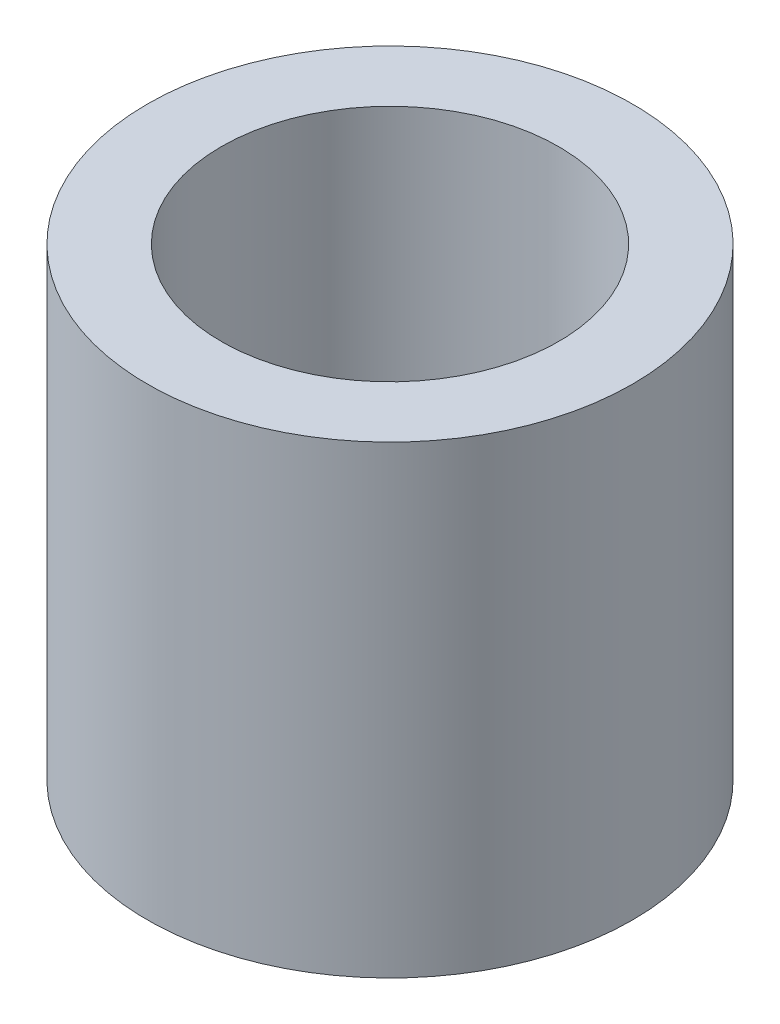
ISO-10303-21;
HEADER;
FILE_DESCRIPTION(('STEP AP214'),'2;1');
FILE_NAME('part.step','',(''),(''),'','','');
FILE_SCHEMA(('AUTOMOTIVE_DESIGN { 1 0 10303 214 1 1 1 1 }'));
ENDSEC;
DATA;
#1=APPLICATION_CONTEXT('core data for automotive mechanical design processes');
#2=APPLICATION_PROTOCOL_DEFINITION('international standard','automotive_design',2000,#1);
#3=PRODUCT_CONTEXT('',#1,'mechanical');
#4=PRODUCT('Part','Part','',(#3));
#5=PRODUCT_RELATED_PRODUCT_CATEGORY('part','',(#4));
#6=PRODUCT_DEFINITION_FORMATION('','',#4);
#7=PRODUCT_DEFINITION_CONTEXT('part definition',#1,'design');
#8=PRODUCT_DEFINITION('design','',#6,#7);
#9=PRODUCT_DEFINITION_SHAPE('','',#8);
#10=(LENGTH_UNIT() NAMED_UNIT(*) SI_UNIT(.MILLI.,.METRE.));
#11=(NAMED_UNIT(*) PLANE_ANGLE_UNIT() SI_UNIT($,.RADIAN.));
#12=(NAMED_UNIT(*) SI_UNIT($,.STERADIAN.) SOLID_ANGLE_UNIT());
#13=UNCERTAINTY_MEASURE_WITH_UNIT(LENGTH_MEASURE(1.E-05),#10,'distance_accuracy_value','');
#14=(GEOMETRIC_REPRESENTATION_CONTEXT(3) GLOBAL_UNCERTAINTY_ASSIGNED_CONTEXT((#13)) GLOBAL_UNIT_ASSIGNED_CONTEXT((#10,
#11,#12)) REPRESENTATION_CONTEXT('',''));
#15=CARTESIAN_POINT('',(0.,0.,0.));
#16=DIRECTION('',(0.,0.,1.));
#17=DIRECTION('',(1.,0.,0.));
#18=AXIS2_PLACEMENT_3D('',#15,#16,#17);
#19=CARTESIAN_POINT('',(0.,0.,0.));
#20=DIRECTION('',(0.,1.,0.));
#21=DIRECTION('',(1.,0.,0.));
#22=AXIS2_PLACEMENT_3D('',#19,#20,#21);
#23=PLANE('',#22);
#24=CARTESIAN_POINT('',(0.,0.,0.));
#25=DIRECTION('',(0.,1.,0.));
#26=DIRECTION('',(-1.,0.,0.));
#27=AXIS2_PLACEMENT_3D('',#24,#25,#26);
#28=CIRCLE('',#27,5.75);
#29=CARTESIAN_POINT('',(-5.75,0.,0.));
#30=VERTEX_POINT('',#29);
#31=EDGE_CURVE('E10',#30,#30,#28,.T.);
#32=ORIENTED_EDGE('',*,*,#31,.F.);
#33=EDGE_LOOP('',(#32));
#34=FACE_BOUND('',#33,.T.);
#35=CARTESIAN_POINT('',(0.,0.,0.));
#36=DIRECTION('',(0.,-1.,0.));
#37=DIRECTION('',(-1.,0.,0.));
#38=AXIS2_PLACEMENT_3D('',#35,#36,#37);
#39=CIRCLE('',#38,4.);
#40=CARTESIAN_POINT('',(-4.,0.,0.));
#41=VERTEX_POINT('',#40);
#42=EDGE_CURVE('E29',#41,#41,#39,.T.);
#43=ORIENTED_EDGE('',*,*,#42,.F.);
#44=EDGE_LOOP('',(#43));
#45=FACE_BOUND('',#44,.T.);
#46=ADVANCED_FACE('F15',(#34,#45),#23,.F.);
#47=CARTESIAN_POINT('',(0.,0.,0.));
#48=DIRECTION('',(0.,1.,0.));
#49=DIRECTION('',(1.,0.,0.));
#50=AXIS2_PLACEMENT_3D('',#47,#48,#49);
#51=CYLINDRICAL_SURFACE('',#50,5.75);
#52=CARTESIAN_POINT('',(0.,11.,0.));
#53=DIRECTION('',(0.,1.,0.));
#54=DIRECTION('',(1.,0.,0.));
#55=AXIS2_PLACEMENT_3D('',#52,#53,#54);
#56=CIRCLE('',#55,5.75);
#57=CARTESIAN_POINT('',(5.75,11.,0.));
#58=VERTEX_POINT('',#57);
#59=EDGE_CURVE('E23',#58,#58,#56,.T.);
#60=ORIENTED_EDGE('',*,*,#59,.F.);
#61=EDGE_LOOP('',(#60));
#62=FACE_BOUND('',#61,.T.);
#63=ORIENTED_EDGE('',*,*,#31,.T.);
#64=EDGE_LOOP('',(#63));
#65=FACE_BOUND('',#64,.T.);
#66=ADVANCED_FACE('F43',(#62,#65),#51,.T.);
#67=CARTESIAN_POINT('',(0.,11.,0.));
#68=DIRECTION('',(0.,1.,0.));
#69=DIRECTION('',(1.,0.,0.));
#70=AXIS2_PLACEMENT_3D('',#67,#68,#69);
#71=PLANE('',#70);
#72=ORIENTED_EDGE('',*,*,#59,.T.);
#73=EDGE_LOOP('',(#72));
#74=FACE_BOUND('',#73,.T.);
#75=CARTESIAN_POINT('',(0.,11.,0.));
#76=DIRECTION('',(0.,-1.,0.));
#77=DIRECTION('',(-1.,0.,0.));
#78=AXIS2_PLACEMENT_3D('',#75,#76,#77);
#79=CIRCLE('',#78,4.);
#80=CARTESIAN_POINT('',(-4.,11.,0.));
#81=VERTEX_POINT('',#80);
#82=EDGE_CURVE('E19',#81,#81,#79,.T.);
#83=ORIENTED_EDGE('',*,*,#82,.T.);
#84=EDGE_LOOP('',(#83));
#85=FACE_BOUND('',#84,.T.);
#86=ADVANCED_FACE('F36',(#74,#85),#71,.T.);
#87=CARTESIAN_POINT('',(0.,0.,0.));
#88=DIRECTION('',(0.,1.,0.));
#89=DIRECTION('',(1.,0.,0.));
#90=AXIS2_PLACEMENT_3D('',#87,#88,#89);
#91=CYLINDRICAL_SURFACE('',#90,4.);
#92=ORIENTED_EDGE('',*,*,#82,.F.);
#93=EDGE_LOOP('',(#92));
#94=FACE_BOUND('',#93,.T.);
#95=ORIENTED_EDGE('',*,*,#42,.T.);
#96=EDGE_LOOP('',(#95));
#97=FACE_BOUND('',#96,.T.);
#98=ADVANCED_FACE('F17',(#94,#97),#91,.F.);
#99=CLOSED_SHELL('',(#46,#66,#86,#98));
#100=MANIFOLD_SOLID_BREP('B1',#99);
#101=ADVANCED_BREP_SHAPE_REPRESENTATION('',(#18,#100),#14);
#102=SHAPE_DEFINITION_REPRESENTATION(#9,#101);
ENDSEC;
END-ISO-10303-21;
